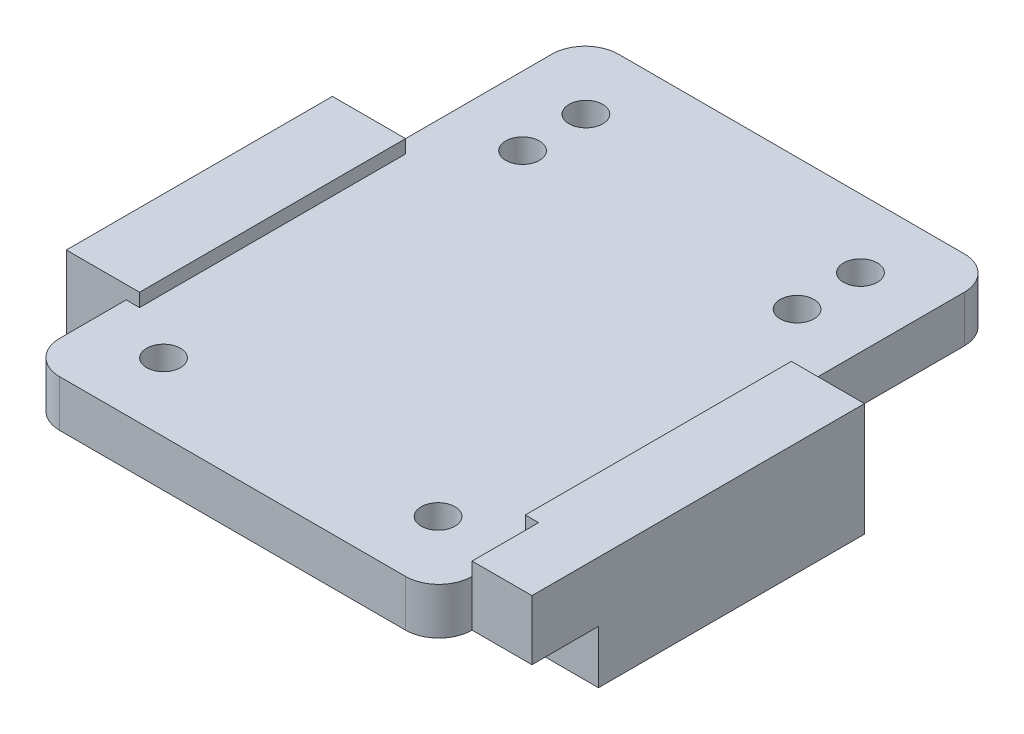
ISO-10303-21;
HEADER;
FILE_DESCRIPTION(('STEP AP214'),'2;1');
FILE_NAME('part.step','',(''),(''),'','','');
FILE_SCHEMA(('AUTOMOTIVE_DESIGN { 1 0 10303 214 1 1 1 1 }'));
ENDSEC;
DATA;
#1=APPLICATION_CONTEXT('core data for automotive mechanical design processes');
#2=APPLICATION_PROTOCOL_DEFINITION('international standard','automotive_design',2000,#1);
#3=PRODUCT_CONTEXT('',#1,'mechanical');
#4=PRODUCT('Part','Part','',(#3));
#5=PRODUCT_RELATED_PRODUCT_CATEGORY('part','',(#4));
#6=PRODUCT_DEFINITION_FORMATION('','',#4);
#7=PRODUCT_DEFINITION_CONTEXT('part definition',#1,'design');
#8=PRODUCT_DEFINITION('design','',#6,#7);
#9=PRODUCT_DEFINITION_SHAPE('','',#8);
#10=(LENGTH_UNIT() NAMED_UNIT(*) SI_UNIT(.MILLI.,.METRE.));
#11=(NAMED_UNIT(*) PLANE_ANGLE_UNIT() SI_UNIT($,.RADIAN.));
#12=(NAMED_UNIT(*) SI_UNIT($,.STERADIAN.) SOLID_ANGLE_UNIT());
#13=UNCERTAINTY_MEASURE_WITH_UNIT(LENGTH_MEASURE(1.E-05),#10,'distance_accuracy_value','');
#14=(GEOMETRIC_REPRESENTATION_CONTEXT(3) GLOBAL_UNCERTAINTY_ASSIGNED_CONTEXT((#13)) GLOBAL_UNIT_ASSIGNED_CONTEXT((#10,
#11,#12)) REPRESENTATION_CONTEXT('',''));
#15=CARTESIAN_POINT('',(0.,0.,0.));
#16=DIRECTION('',(0.,0.,1.));
#17=DIRECTION('',(1.,0.,0.));
#18=AXIS2_PLACEMENT_3D('',#15,#16,#17);
#19=CARTESIAN_POINT('',(29.,52.4849370253831,27.));
#20=DIRECTION('',(0.,0.,1.));
#21=DIRECTION('',(1.,0.,0.));
#22=AXIS2_PLACEMENT_3D('',#19,#20,#21);
#23=PLANE('',#22);
#24=DIRECTION('',(0.,-1.,0.));
#25=VECTOR('',#24,1.);
#26=CARTESIAN_POINT('',(40.,52.4849370253831,27.));
#27=LINE('',#26,#25);
#28=CARTESIAN_POINT('',(40.,0.,27.));
#29=VERTEX_POINT('',#28);
#30=CARTESIAN_POINT('',(40.,-8.,27.));
#31=VERTEX_POINT('',#30);
#32=EDGE_CURVE('E310',#29,#31,#27,.T.);
#33=ORIENTED_EDGE('',*,*,#32,.F.);
#34=DIRECTION('',(-1.,0.,0.));
#35=VECTOR('',#34,1.);
#36=CARTESIAN_POINT('',(0.,0.,27.));
#37=LINE('',#36,#35);
#38=CARTESIAN_POINT('',(29.,0.,27.));
#39=VERTEX_POINT('',#38);
#40=EDGE_CURVE('E223',#29,#39,#37,.T.);
#41=ORIENTED_EDGE('',*,*,#40,.T.);
#42=DIRECTION('',(0.,-1.,0.));
#43=VECTOR('',#42,1.);
#44=CARTESIAN_POINT('',(29.,52.4849370253831,27.));
#45=LINE('',#44,#43);
#46=CARTESIAN_POINT('',(29.,-8.,27.));
#47=VERTEX_POINT('',#46);
#48=EDGE_CURVE('E309',#39,#47,#45,.T.);
#49=ORIENTED_EDGE('',*,*,#48,.T.);
#50=DIRECTION('',(-1.,0.,0.));
#51=VECTOR('',#50,1.);
#52=CARTESIAN_POINT('',(29.,-8.,27.));
#53=LINE('',#52,#51);
#54=EDGE_CURVE('E295',#31,#47,#53,.T.);
#55=ORIENTED_EDGE('',*,*,#54,.F.);
#56=EDGE_LOOP('',(#33,#41,#49,#55));
#57=FACE_BOUND('',#56,.T.);
#58=ADVANCED_FACE('F46',(#57),#23,.T.);
#59=DIRECTION('',(-1.,0.,0.));
#60=VECTOR('',#59,1.);
#61=CARTESIAN_POINT('',(0.,7.,27.));
#62=LINE('',#61,#60);
#63=CARTESIAN_POINT('',(31.,7.00000000000001,27.));
#64=VERTEX_POINT('',#63);
#65=CARTESIAN_POINT('',(29.,7.,27.));
#66=VERTEX_POINT('',#65);
#67=EDGE_CURVE('E323',#64,#66,#62,.T.);
#68=ORIENTED_EDGE('',*,*,#67,.F.);
#69=DIRECTION('',(0.,1.,0.));
#70=VECTOR('',#69,1.);
#71=CARTESIAN_POINT('',(31.,0.,27.));
#72=LINE('',#71,#70);
#73=CARTESIAN_POINT('',(31.,9.,27.));
#74=VERTEX_POINT('',#73);
#75=EDGE_CURVE('E611',#64,#74,#72,.T.);
#76=ORIENTED_EDGE('',*,*,#75,.T.);
#77=DIRECTION('',(1.,0.,0.));
#78=VECTOR('',#77,1.);
#79=CARTESIAN_POINT('',(29.,9.,27.));
#80=LINE('',#79,#78);
#81=CARTESIAN_POINT('',(29.,9.,27.));
#82=VERTEX_POINT('',#81);
#83=EDGE_CURVE('E300',#82,#74,#80,.T.);
#84=ORIENTED_EDGE('',*,*,#83,.F.);
#85=EDGE_CURVE('E301',#82,#66,#45,.T.);
#86=ORIENTED_EDGE('',*,*,#85,.T.);
#87=EDGE_LOOP('',(#68,#76,#84,#86));
#88=FACE_BOUND('',#87,.T.);
#89=ADVANCED_FACE('F506',(#88),#23,.T.);
#90=CARTESIAN_POINT('',(-31.,7.,-42.));
#91=DIRECTION('',(1.,0.,0.));
#92=DIRECTION('',(0.,0.,-1.));
#93=AXIS2_PLACEMENT_3D('',#90,#91,#92);
#94=PLANE('',#93);
#95=DIRECTION('',(0.,0.,1.));
#96=VECTOR('',#95,1.);
#97=CARTESIAN_POINT('',(-31.,7.,-42.));
#98=LINE('',#97,#96);
#99=CARTESIAN_POINT('',(-31.,7.,27.));
#100=VERTEX_POINT('',#99);
#101=CARTESIAN_POINT('',(-31.,7.,37.));
#102=VERTEX_POINT('',#101);
#103=EDGE_CURVE('E351',#100,#102,#98,.T.);
#104=ORIENTED_EDGE('',*,*,#103,.F.);
#105=DIRECTION('',(0.,-1.,0.));
#106=VECTOR('',#105,1.);
#107=CARTESIAN_POINT('',(-31.,7.,27.));
#108=LINE('',#107,#106);
#109=CARTESIAN_POINT('',(-31.,0.,27.));
#110=VERTEX_POINT('',#109);
#111=EDGE_CURVE('E282',#100,#110,#108,.T.);
#112=ORIENTED_EDGE('',*,*,#111,.T.);
#113=DIRECTION('',(0.,0.,1.));
#114=VECTOR('',#113,1.);
#115=CARTESIAN_POINT('',(-31.,0.,-42.));
#116=LINE('',#115,#114);
#117=CARTESIAN_POINT('',(-31.,0.,37.));
#118=VERTEX_POINT('',#117);
#119=EDGE_CURVE('E366',#110,#118,#116,.T.);
#120=ORIENTED_EDGE('',*,*,#119,.T.);
#121=DIRECTION('',(0.,-1.,0.));
#122=VECTOR('',#121,1.);
#123=CARTESIAN_POINT('',(-31.,7.,37.));
#124=LINE('',#123,#122);
#125=EDGE_CURVE('E424',#118,#102,#124,.F.);
#126=ORIENTED_EDGE('',*,*,#125,.T.);
#127=EDGE_LOOP('',(#104,#112,#120,#126));
#128=FACE_BOUND('',#127,.T.);
#129=ADVANCED_FACE('F511',(#128),#94,.F.);
#130=CARTESIAN_POINT('',(-31.,0.,-37.));
#131=VERTEX_POINT('',#130);
#132=CARTESIAN_POINT('',(-31.,0.,-12.9999999999999));
#133=VERTEX_POINT('',#132);
#134=EDGE_CURVE('E362',#131,#133,#116,.T.);
#135=ORIENTED_EDGE('',*,*,#134,.T.);
#136=DIRECTION('',(0.,1.,0.));
#137=VECTOR('',#136,1.);
#138=CARTESIAN_POINT('',(-31.,7.,-12.9999999999999));
#139=LINE('',#138,#137);
#140=CARTESIAN_POINT('',(-31.,7.,-12.9999999999999));
#141=VERTEX_POINT('',#140);
#142=EDGE_CURVE('E278',#133,#141,#139,.T.);
#143=ORIENTED_EDGE('',*,*,#142,.T.);
#144=CARTESIAN_POINT('',(-31.,7.,-37.));
#145=VERTEX_POINT('',#144);
#146=EDGE_CURVE('E348',#145,#141,#98,.T.);
#147=ORIENTED_EDGE('',*,*,#146,.F.);
#148=DIRECTION('',(0.,-1.,0.));
#149=VECTOR('',#148,1.);
#150=CARTESIAN_POINT('',(-31.,7.,-37.));
#151=LINE('',#150,#149);
#152=EDGE_CURVE('E405',#145,#131,#151,.T.);
#153=ORIENTED_EDGE('',*,*,#152,.T.);
#154=EDGE_LOOP('',(#135,#143,#147,#153));
#155=FACE_BOUND('',#154,.T.);
#156=ADVANCED_FACE('F460',(#155),#94,.F.);
#157=CARTESIAN_POINT('',(31.,7.,42.));
#158=DIRECTION('',(0.,0.,-1.));
#159=DIRECTION('',(-1.,0.,0.));
#160=AXIS2_PLACEMENT_3D('',#157,#158,#159);
#161=PLANE('',#160);
#162=DIRECTION('',(1.,0.,0.));
#163=VECTOR('',#162,1.);
#164=CARTESIAN_POINT('',(31.,0.,42.));
#165=LINE('',#164,#163);
#166=CARTESIAN_POINT('',(-26.,0.,42.));
#167=VERTEX_POINT('',#166);
#168=CARTESIAN_POINT('',(26.,0.,42.));
#169=VERTEX_POINT('',#168);
#170=EDGE_CURVE('E365',#167,#169,#165,.T.);
#171=ORIENTED_EDGE('',*,*,#170,.T.);
#172=DIRECTION('',(0.,-1.,0.));
#173=VECTOR('',#172,1.);
#174=CARTESIAN_POINT('',(26.,7.,42.));
#175=LINE('',#174,#173);
#176=CARTESIAN_POINT('',(26.,7.,42.));
#177=VERTEX_POINT('',#176);
#178=EDGE_CURVE('E417',#169,#177,#175,.F.);
#179=ORIENTED_EDGE('',*,*,#178,.T.);
#180=DIRECTION('',(1.,0.,0.));
#181=VECTOR('',#180,1.);
#182=CARTESIAN_POINT('',(31.,7.,42.));
#183=LINE('',#182,#181);
#184=CARTESIAN_POINT('',(-26.,7.,42.));
#185=VERTEX_POINT('',#184);
#186=EDGE_CURVE('E350',#185,#177,#183,.T.);
#187=ORIENTED_EDGE('',*,*,#186,.F.);
#188=DIRECTION('',(0.,-1.,0.));
#189=VECTOR('',#188,1.);
#190=CARTESIAN_POINT('',(-26.,7.,42.));
#191=LINE('',#190,#189);
#192=EDGE_CURVE('E414',#185,#167,#191,.T.);
#193=ORIENTED_EDGE('',*,*,#192,.T.);
#194=EDGE_LOOP('',(#171,#179,#187,#193));
#195=FACE_BOUND('',#194,.T.);
#196=ADVANCED_FACE('F555',(#195),#161,.F.);
#197=CARTESIAN_POINT('',(31.,7.,-42.));
#198=DIRECTION('',(-1.,0.,0.));
#199=DIRECTION('',(0.,0.,1.));
#200=AXIS2_PLACEMENT_3D('',#197,#198,#199);
#201=PLANE('',#200);
#202=DIRECTION('',(0.,0.,-1.));
#203=VECTOR('',#202,1.);
#204=CARTESIAN_POINT('',(31.,7.,-42.));
#205=LINE('',#204,#203);
#206=CARTESIAN_POINT('',(31.,7.,-13.));
#207=VERTEX_POINT('',#206);
#208=CARTESIAN_POINT('',(31.,7.,-37.));
#209=VERTEX_POINT('',#208);
#210=EDGE_CURVE('E354',#207,#209,#205,.T.);
#211=ORIENTED_EDGE('',*,*,#210,.F.);
#212=DIRECTION('',(0.,-1.,0.));
#213=VECTOR('',#212,1.);
#214=CARTESIAN_POINT('',(31.,7.,-13.));
#215=LINE('',#214,#213);
#216=CARTESIAN_POINT('',(31.,0.,-13.));
#217=VERTEX_POINT('',#216);
#218=EDGE_CURVE('E318',#207,#217,#215,.T.);
#219=ORIENTED_EDGE('',*,*,#218,.T.);
#220=DIRECTION('',(0.,0.,-1.));
#221=VECTOR('',#220,1.);
#222=CARTESIAN_POINT('',(31.,0.,-42.));
#223=LINE('',#222,#221);
#224=CARTESIAN_POINT('',(31.,0.,-37.));
#225=VERTEX_POINT('',#224);
#226=EDGE_CURVE('E369',#217,#225,#223,.T.);
#227=ORIENTED_EDGE('',*,*,#226,.T.);
#228=DIRECTION('',(0.,-1.,0.));
#229=VECTOR('',#228,1.);
#230=CARTESIAN_POINT('',(31.,7.,-37.));
#231=LINE('',#230,#229);
#232=EDGE_CURVE('E398',#225,#209,#231,.F.);
#233=ORIENTED_EDGE('',*,*,#232,.T.);
#234=EDGE_LOOP('',(#211,#219,#227,#233));
#235=FACE_BOUND('',#234,.T.);
#236=ADVANCED_FACE('F479',(#235),#201,.F.);
#237=CARTESIAN_POINT('',(31.,7.,-42.));
#238=DIRECTION('',(0.,0.,1.));
#239=DIRECTION('',(1.,0.,0.));
#240=AXIS2_PLACEMENT_3D('',#237,#238,#239);
#241=PLANE('',#240);
#242=DIRECTION('',(-1.,0.,0.));
#243=VECTOR('',#242,1.);
#244=CARTESIAN_POINT('',(31.,7.,-42.));
#245=LINE('',#244,#243);
#246=CARTESIAN_POINT('',(26.,7.,-42.));
#247=VERTEX_POINT('',#246);
#248=CARTESIAN_POINT('',(-26.,7.,-42.));
#249=VERTEX_POINT('',#248);
#250=EDGE_CURVE('E358',#247,#249,#245,.T.);
#251=ORIENTED_EDGE('',*,*,#250,.F.);
#252=DIRECTION('',(0.,-1.,0.));
#253=VECTOR('',#252,1.);
#254=CARTESIAN_POINT('',(26.,7.,-42.));
#255=LINE('',#254,#253);
#256=CARTESIAN_POINT('',(26.,0.,-42.));
#257=VERTEX_POINT('',#256);
#258=EDGE_CURVE('E390',#247,#257,#255,.T.);
#259=ORIENTED_EDGE('',*,*,#258,.T.);
#260=DIRECTION('',(-1.,0.,0.));
#261=VECTOR('',#260,1.);
#262=CARTESIAN_POINT('',(31.,0.,-42.));
#263=LINE('',#262,#261);
#264=CARTESIAN_POINT('',(-26.,0.,-42.));
#265=VERTEX_POINT('',#264);
#266=EDGE_CURVE('E371',#257,#265,#263,.T.);
#267=ORIENTED_EDGE('',*,*,#266,.T.);
#268=DIRECTION('',(0.,-1.,0.));
#269=VECTOR('',#268,1.);
#270=CARTESIAN_POINT('',(-26.,7.,-42.));
#271=LINE('',#270,#269);
#272=EDGE_CURVE('E361',#265,#249,#271,.F.);
#273=ORIENTED_EDGE('',*,*,#272,.T.);
#274=EDGE_LOOP('',(#251,#259,#267,#273));
#275=FACE_BOUND('',#274,.T.);
#276=ADVANCED_FACE('F470',(#275),#241,.F.);
#277=CARTESIAN_POINT('',(0.,7.,0.));
#278=DIRECTION('',(0.,-1.,0.));
#279=DIRECTION('',(0.,0.,-1.));
#280=AXIS2_PLACEMENT_3D('',#277,#278,#279);
#281=PLANE('',#280);
#282=CARTESIAN_POINT('',(20.6375,7.,-22.225));
#283=DIRECTION('',(0.,-1.,0.));
#284=DIRECTION('',(0.,0.,-1.));
#285=AXIS2_PLACEMENT_3D('',#282,#283,#284);
#286=CIRCLE('',#285,2.54);
#287=CARTESIAN_POINT('',(20.6375,7.,-24.765));
#288=VERTEX_POINT('',#287);
#289=EDGE_CURVE('E328',#288,#288,#286,.T.);
#290=ORIENTED_EDGE('',*,*,#289,.T.);
#291=EDGE_LOOP('',(#290));
#292=FACE_BOUND('',#291,.T.);
#293=CARTESIAN_POINT('',(20.6375,7.,-31.75));
#294=DIRECTION('',(0.,-1.,0.));
#295=DIRECTION('',(0.,0.,-1.));
#296=AXIS2_PLACEMENT_3D('',#293,#294,#295);
#297=CIRCLE('',#296,2.54);
#298=CARTESIAN_POINT('',(20.6375,7.,-34.29));
#299=VERTEX_POINT('',#298);
#300=EDGE_CURVE('E332',#299,#299,#297,.T.);
#301=ORIENTED_EDGE('',*,*,#300,.T.);
#302=EDGE_LOOP('',(#301));
#303=FACE_BOUND('',#302,.T.);
#304=CARTESIAN_POINT('',(-20.6375,7.,-31.75));
#305=DIRECTION('',(0.,-1.,0.));
#306=DIRECTION('',(0.,0.,-1.));
#307=AXIS2_PLACEMENT_3D('',#304,#305,#306);
#308=CIRCLE('',#307,2.54);
#309=CARTESIAN_POINT('',(-20.6375,7.,-34.29));
#310=VERTEX_POINT('',#309);
#311=EDGE_CURVE('E335',#310,#310,#308,.T.);
#312=ORIENTED_EDGE('',*,*,#311,.T.);
#313=EDGE_LOOP('',(#312));
#314=FACE_BOUND('',#313,.T.);
#315=CARTESIAN_POINT('',(-20.6375,7.,-22.225));
#316=DIRECTION('',(0.,-1.,0.));
#317=DIRECTION('',(0.,0.,-1.));
#318=AXIS2_PLACEMENT_3D('',#315,#316,#317);
#319=CIRCLE('',#318,2.54);
#320=CARTESIAN_POINT('',(-20.6375,7.,-24.765));
#321=VERTEX_POINT('',#320);
#322=EDGE_CURVE('E338',#321,#321,#319,.T.);
#323=ORIENTED_EDGE('',*,*,#322,.T.);
#324=EDGE_LOOP('',(#323));
#325=FACE_BOUND('',#324,.T.);
#326=CARTESIAN_POINT('',(-20.6375,7.,31.75));
#327=DIRECTION('',(0.,-1.,0.));
#328=DIRECTION('',(0.,0.,-1.));
#329=AXIS2_PLACEMENT_3D('',#326,#327,#328);
#330=CIRCLE('',#329,2.54);
#331=CARTESIAN_POINT('',(-20.6375,7.,29.21));
#332=VERTEX_POINT('',#331);
#333=EDGE_CURVE('E327',#332,#332,#330,.T.);
#334=ORIENTED_EDGE('',*,*,#333,.T.);
#335=EDGE_LOOP('',(#334));
#336=FACE_BOUND('',#335,.T.);
#337=CARTESIAN_POINT('',(20.6375,7.,31.75));
#338=DIRECTION('',(0.,-1.,0.));
#339=DIRECTION('',(0.,0.,-1.));
#340=AXIS2_PLACEMENT_3D('',#337,#338,#339);
#341=CIRCLE('',#340,2.54);
#342=CARTESIAN_POINT('',(20.6375,7.,29.21));
#343=VERTEX_POINT('',#342);
#344=EDGE_CURVE('E343',#343,#343,#341,.T.);
#345=ORIENTED_EDGE('',*,*,#344,.T.);
#346=EDGE_LOOP('',(#345));
#347=FACE_BOUND('',#346,.T.);
#348=DIRECTION('',(0.,0.,1.));
#349=VECTOR('',#348,1.);
#350=CARTESIAN_POINT('',(-29.,7.,0.));
#351=LINE('',#350,#349);
#352=CARTESIAN_POINT('',(-29.,7.,-12.9999999999999));
#353=VERTEX_POINT('',#352);
#354=CARTESIAN_POINT('',(-29.,7.,27.));
#355=VERTEX_POINT('',#354);
#356=EDGE_CURVE('E61',#353,#355,#351,.T.);
#357=ORIENTED_EDGE('',*,*,#356,.T.);
#358=DIRECTION('',(-1.,0.,0.));
#359=VECTOR('',#358,1.);
#360=CARTESIAN_POINT('',(0.,7.,27.));
#361=LINE('',#360,#359);
#362=EDGE_CURVE('E284',#355,#100,#361,.T.);
#363=ORIENTED_EDGE('',*,*,#362,.T.);
#364=ORIENTED_EDGE('',*,*,#103,.T.);
#365=CARTESIAN_POINT('',(-26.,7.,37.));
#366=DIRECTION('',(0.,-1.,0.));
#367=DIRECTION('',(0.,0.,-1.));
#368=AXIS2_PLACEMENT_3D('',#365,#366,#367);
#369=CIRCLE('',#368,5.);
#370=EDGE_CURVE('E419',#102,#185,#369,.F.);
#371=ORIENTED_EDGE('',*,*,#370,.T.);
#372=ORIENTED_EDGE('',*,*,#186,.T.);
#373=CARTESIAN_POINT('',(26.,7.,37.));
#374=DIRECTION('',(0.,-1.,0.));
#375=DIRECTION('',(0.,0.,-1.));
#376=AXIS2_PLACEMENT_3D('',#373,#374,#375);
#377=CIRCLE('',#376,5.);
#378=CARTESIAN_POINT('',(31.,7.,37.));
#379=VERTEX_POINT('',#378);
#380=EDGE_CURVE('E421',#177,#379,#377,.F.);
#381=ORIENTED_EDGE('',*,*,#380,.T.);
#382=EDGE_CURVE('E355',#379,#64,#205,.T.);
#383=ORIENTED_EDGE('',*,*,#382,.T.);
#384=ORIENTED_EDGE('',*,*,#67,.T.);
#385=DIRECTION('',(0.,0.,-1.));
#386=VECTOR('',#385,1.);
#387=CARTESIAN_POINT('',(29.,7.,0.));
#388=LINE('',#387,#386);
#389=CARTESIAN_POINT('',(29.,7.,-13.));
#390=VERTEX_POINT('',#389);
#391=EDGE_CURVE('E325',#66,#390,#388,.T.);
#392=ORIENTED_EDGE('',*,*,#391,.T.);
#393=DIRECTION('',(1.,0.,0.));
#394=VECTOR('',#393,1.);
#395=CARTESIAN_POINT('',(0.,7.,-13.));
#396=LINE('',#395,#394);
#397=EDGE_CURVE('E321',#390,#207,#396,.T.);
#398=ORIENTED_EDGE('',*,*,#397,.T.);
#399=ORIENTED_EDGE('',*,*,#210,.T.);
#400=CARTESIAN_POINT('',(26.,7.,-37.));
#401=DIRECTION('',(0.,-1.,0.));
#402=DIRECTION('',(0.,0.,-1.));
#403=AXIS2_PLACEMENT_3D('',#400,#401,#402);
#404=CIRCLE('',#403,5.);
#405=EDGE_CURVE('E403',#209,#247,#404,.F.);
#406=ORIENTED_EDGE('',*,*,#405,.T.);
#407=ORIENTED_EDGE('',*,*,#250,.T.);
#408=CARTESIAN_POINT('',(-26.,7.,-37.));
#409=DIRECTION('',(0.,-1.,0.));
#410=DIRECTION('',(0.,0.,-1.));
#411=AXIS2_PLACEMENT_3D('',#408,#409,#410);
#412=CIRCLE('',#411,5.);
#413=EDGE_CURVE('E401',#249,#145,#412,.F.);
#414=ORIENTED_EDGE('',*,*,#413,.T.);
#415=ORIENTED_EDGE('',*,*,#146,.T.);
#416=DIRECTION('',(1.,0.,0.));
#417=VECTOR('',#416,1.);
#418=CARTESIAN_POINT('',(0.,7.,-12.9999999999999));
#419=LINE('',#418,#417);
#420=EDGE_CURVE('E66',#141,#353,#419,.T.);
#421=ORIENTED_EDGE('',*,*,#420,.T.);
#422=EDGE_LOOP('',(#357,#363,#364,#371,#372,#381,#383,#384,#392,#398,#399,#406,#407,#414,#415,#421));
#423=FACE_BOUND('',#422,.T.);
#424=ADVANCED_FACE('F545',(#292,#303,#314,#325,#336,#347,#423),#281,.F.);
#425=CARTESIAN_POINT('',(0.,0.,0.));
#426=DIRECTION('',(0.,-1.,0.));
#427=DIRECTION('',(0.,0.,-1.));
#428=AXIS2_PLACEMENT_3D('',#425,#426,#427);
#429=PLANE('',#428);
#430=DIRECTION('',(-1.,0.,0.));
#431=VECTOR('',#430,1.);
#432=CARTESIAN_POINT('',(0.,0.,27.));
#433=LINE('',#432,#431);
#434=CARTESIAN_POINT('',(-29.,0.,27.));
#435=VERTEX_POINT('',#434);
#436=EDGE_CURVE('E12',#435,#110,#433,.T.);
#437=ORIENTED_EDGE('',*,*,#436,.F.);
#438=DIRECTION('',(0.,0.,1.));
#439=VECTOR('',#438,1.);
#440=CARTESIAN_POINT('',(-29.,0.,0.));
#441=LINE('',#440,#439);
#442=CARTESIAN_POINT('',(-29.,0.,-12.9999999999999));
#443=VERTEX_POINT('',#442);
#444=EDGE_CURVE('E54',#443,#435,#441,.T.);
#445=ORIENTED_EDGE('',*,*,#444,.F.);
#446=DIRECTION('',(1.,0.,0.));
#447=VECTOR('',#446,1.);
#448=CARTESIAN_POINT('',(0.,0.,-12.9999999999999));
#449=LINE('',#448,#447);
#450=EDGE_CURVE('E434',#133,#443,#449,.T.);
#451=ORIENTED_EDGE('',*,*,#450,.F.);
#452=ORIENTED_EDGE('',*,*,#134,.F.);
#453=CARTESIAN_POINT('',(-26.,0.,-37.));
#454=DIRECTION('',(0.,-1.,0.));
#455=DIRECTION('',(0.,0.,-1.));
#456=AXIS2_PLACEMENT_3D('',#453,#454,#455);
#457=CIRCLE('',#456,5.);
#458=EDGE_CURVE('E393',#131,#265,#457,.T.);
#459=ORIENTED_EDGE('',*,*,#458,.T.);
#460=ORIENTED_EDGE('',*,*,#266,.F.);
#461=CARTESIAN_POINT('',(26.,0.,-37.));
#462=DIRECTION('',(0.,-1.,0.));
#463=DIRECTION('',(0.,0.,-1.));
#464=AXIS2_PLACEMENT_3D('',#461,#462,#463);
#465=CIRCLE('',#464,5.);
#466=EDGE_CURVE('E395',#257,#225,#465,.T.);
#467=ORIENTED_EDGE('',*,*,#466,.T.);
#468=ORIENTED_EDGE('',*,*,#226,.F.);
#469=DIRECTION('',(1.,0.,0.));
#470=VECTOR('',#469,1.);
#471=CARTESIAN_POINT('',(0.,0.,-13.));
#472=LINE('',#471,#470);
#473=CARTESIAN_POINT('',(29.,0.,-13.));
#474=VERTEX_POINT('',#473);
#475=EDGE_CURVE('E427',#474,#217,#472,.T.);
#476=ORIENTED_EDGE('',*,*,#475,.F.);
#477=DIRECTION('',(0.,0.,-1.));
#478=VECTOR('',#477,1.);
#479=CARTESIAN_POINT('',(29.,0.,0.));
#480=LINE('',#479,#478);
#481=EDGE_CURVE('E430',#39,#474,#480,.T.);
#482=ORIENTED_EDGE('',*,*,#481,.F.);
#483=ORIENTED_EDGE('',*,*,#40,.F.);
#484=DIRECTION('',(0.,0.,-1.));
#485=VECTOR('',#484,1.);
#486=CARTESIAN_POINT('',(40.,0.,37.));
#487=LINE('',#486,#485);
#488=CARTESIAN_POINT('',(40.,0.,37.));
#489=VERTEX_POINT('',#488);
#490=EDGE_CURVE('E215',#489,#29,#487,.T.);
#491=ORIENTED_EDGE('',*,*,#490,.F.);
#492=DIRECTION('',(-1.,0.,0.));
#493=VECTOR('',#492,1.);
#494=CARTESIAN_POINT('',(40.,0.,37.));
#495=LINE('',#494,#493);
#496=CARTESIAN_POINT('',(31.,0.,37.));
#497=VERTEX_POINT('',#496);
#498=EDGE_CURVE('E220',#489,#497,#495,.T.);
#499=ORIENTED_EDGE('',*,*,#498,.T.);
#500=CARTESIAN_POINT('',(26.,0.,37.));
#501=DIRECTION('',(0.,-1.,0.));
#502=DIRECTION('',(0.,0.,-1.));
#503=AXIS2_PLACEMENT_3D('',#500,#501,#502);
#504=CIRCLE('',#503,5.);
#505=EDGE_CURVE('E412',#497,#169,#504,.T.);
#506=ORIENTED_EDGE('',*,*,#505,.T.);
#507=ORIENTED_EDGE('',*,*,#170,.F.);
#508=CARTESIAN_POINT('',(-26.,0.,37.));
#509=DIRECTION('',(0.,-1.,0.));
#510=DIRECTION('',(0.,0.,-1.));
#511=AXIS2_PLACEMENT_3D('',#508,#509,#510);
#512=CIRCLE('',#511,5.);
#513=EDGE_CURVE('E409',#167,#118,#512,.T.);
#514=ORIENTED_EDGE('',*,*,#513,.T.);
#515=ORIENTED_EDGE('',*,*,#119,.F.);
#516=EDGE_LOOP('',(#437,#445,#451,#452,#459,#460,#467,#468,#476,#482,#483,#491,#499,#506,#507,
#514,#515));
#517=FACE_BOUND('',#516,.T.);
#518=CARTESIAN_POINT('',(20.6375,0.,-22.225));
#519=DIRECTION('',(0.,-1.,0.));
#520=DIRECTION('',(0.,0.,-1.));
#521=AXIS2_PLACEMENT_3D('',#518,#519,#520);
#522=CIRCLE('',#521,2.54);
#523=CARTESIAN_POINT('',(20.6375,0.,-24.765));
#524=VERTEX_POINT('',#523);
#525=EDGE_CURVE('E347',#524,#524,#522,.T.);
#526=ORIENTED_EDGE('',*,*,#525,.F.);
#527=EDGE_LOOP('',(#526));
#528=FACE_BOUND('',#527,.T.);
#529=CARTESIAN_POINT('',(20.6375,0.,-31.75));
#530=DIRECTION('',(0.,-1.,0.));
#531=DIRECTION('',(0.,0.,-1.));
#532=AXIS2_PLACEMENT_3D('',#529,#530,#531);
#533=CIRCLE('',#532,2.54);
#534=CARTESIAN_POINT('',(20.6375,0.,-34.29));
#535=VERTEX_POINT('',#534);
#536=EDGE_CURVE('E384',#535,#535,#533,.T.);
#537=ORIENTED_EDGE('',*,*,#536,.F.);
#538=EDGE_LOOP('',(#537));
#539=FACE_BOUND('',#538,.T.);
#540=CARTESIAN_POINT('',(-20.6375,0.,-31.75));
#541=DIRECTION('',(0.,-1.,0.));
#542=DIRECTION('',(0.,0.,-1.));
#543=AXIS2_PLACEMENT_3D('',#540,#541,#542);
#544=CIRCLE('',#543,2.54);
#545=CARTESIAN_POINT('',(-20.6375,0.,-34.29));
#546=VERTEX_POINT('',#545);
#547=EDGE_CURVE('E381',#546,#546,#544,.T.);
#548=ORIENTED_EDGE('',*,*,#547,.F.);
#549=EDGE_LOOP('',(#548));
#550=FACE_BOUND('',#549,.T.);
#551=CARTESIAN_POINT('',(-20.6375,0.,-22.225));
#552=DIRECTION('',(0.,-1.,0.));
#553=DIRECTION('',(0.,0.,-1.));
#554=AXIS2_PLACEMENT_3D('',#551,#552,#553);
#555=CIRCLE('',#554,2.54);
#556=CARTESIAN_POINT('',(-20.6375,0.,-24.765));
#557=VERTEX_POINT('',#556);
#558=EDGE_CURVE('E378',#557,#557,#555,.T.);
#559=ORIENTED_EDGE('',*,*,#558,.F.);
#560=EDGE_LOOP('',(#559));
#561=FACE_BOUND('',#560,.T.);
#562=CARTESIAN_POINT('',(-20.6375,0.,31.75));
#563=DIRECTION('',(0.,-1.,0.));
#564=DIRECTION('',(0.,0.,-1.));
#565=AXIS2_PLACEMENT_3D('',#562,#563,#564);
#566=CIRCLE('',#565,2.54);
#567=CARTESIAN_POINT('',(-20.6375,0.,29.21));
#568=VERTEX_POINT('',#567);
#569=EDGE_CURVE('E331',#568,#568,#566,.T.);
#570=ORIENTED_EDGE('',*,*,#569,.F.);
#571=EDGE_LOOP('',(#570));
#572=FACE_BOUND('',#571,.T.);
#573=CARTESIAN_POINT('',(20.6375,0.,31.75));
#574=DIRECTION('',(0.,-1.,0.));
#575=DIRECTION('',(0.,0.,-1.));
#576=AXIS2_PLACEMENT_3D('',#573,#574,#575);
#577=CIRCLE('',#576,2.54);
#578=CARTESIAN_POINT('',(20.6375,0.,29.21));
#579=VERTEX_POINT('',#578);
#580=EDGE_CURVE('E346',#579,#579,#577,.T.);
#581=ORIENTED_EDGE('',*,*,#580,.F.);
#582=EDGE_LOOP('',(#581));
#583=FACE_BOUND('',#582,.T.);
#584=ADVANCED_FACE('F217',(#517,#528,#539,#550,#561,#572,#583),#429,.T.);
#585=CARTESIAN_POINT('',(20.6375,7.,31.75));
#586=DIRECTION('',(0.,-1.,0.));
#587=DIRECTION('',(0.,0.,-1.));
#588=AXIS2_PLACEMENT_3D('',#585,#586,#587);
#589=CYLINDRICAL_SURFACE('',#588,2.54);
#590=ORIENTED_EDGE('',*,*,#580,.T.);
#591=EDGE_LOOP('',(#590));
#592=FACE_BOUND('',#591,.T.);
#593=ORIENTED_EDGE('',*,*,#344,.F.);
#594=EDGE_LOOP('',(#593));
#595=FACE_BOUND('',#594,.T.);
#596=ADVANCED_FACE('F540',(#592,#595),#589,.F.);
#597=CARTESIAN_POINT('',(-20.6375,7.,31.75));
#598=DIRECTION('',(0.,-1.,0.));
#599=DIRECTION('',(0.,0.,-1.));
#600=AXIS2_PLACEMENT_3D('',#597,#598,#599);
#601=CYLINDRICAL_SURFACE('',#600,2.54);
#602=ORIENTED_EDGE('',*,*,#569,.T.);
#603=EDGE_LOOP('',(#602));
#604=FACE_BOUND('',#603,.T.);
#605=ORIENTED_EDGE('',*,*,#333,.F.);
#606=EDGE_LOOP('',(#605));
#607=FACE_BOUND('',#606,.T.);
#608=ADVANCED_FACE('F536',(#604,#607),#601,.F.);
#609=CARTESIAN_POINT('',(-20.6375,7.,-22.225));
#610=DIRECTION('',(0.,-1.,0.));
#611=DIRECTION('',(0.,0.,-1.));
#612=AXIS2_PLACEMENT_3D('',#609,#610,#611);
#613=CYLINDRICAL_SURFACE('',#612,2.54);
#614=ORIENTED_EDGE('',*,*,#558,.T.);
#615=EDGE_LOOP('',(#614));
#616=FACE_BOUND('',#615,.T.);
#617=ORIENTED_EDGE('',*,*,#322,.F.);
#618=EDGE_LOOP('',(#617));
#619=FACE_BOUND('',#618,.T.);
#620=ADVANCED_FACE('F532',(#616,#619),#613,.F.);
#621=CARTESIAN_POINT('',(-20.6375,7.,-31.75));
#622=DIRECTION('',(0.,-1.,0.));
#623=DIRECTION('',(0.,0.,-1.));
#624=AXIS2_PLACEMENT_3D('',#621,#622,#623);
#625=CYLINDRICAL_SURFACE('',#624,2.54);
#626=ORIENTED_EDGE('',*,*,#547,.T.);
#627=EDGE_LOOP('',(#626));
#628=FACE_BOUND('',#627,.T.);
#629=ORIENTED_EDGE('',*,*,#311,.F.);
#630=EDGE_LOOP('',(#629));
#631=FACE_BOUND('',#630,.T.);
#632=ADVANCED_FACE('F528',(#628,#631),#625,.F.);
#633=CARTESIAN_POINT('',(20.6375,7.,-31.75));
#634=DIRECTION('',(0.,-1.,0.));
#635=DIRECTION('',(0.,0.,-1.));
#636=AXIS2_PLACEMENT_3D('',#633,#634,#635);
#637=CYLINDRICAL_SURFACE('',#636,2.54);
#638=ORIENTED_EDGE('',*,*,#536,.T.);
#639=EDGE_LOOP('',(#638));
#640=FACE_BOUND('',#639,.T.);
#641=ORIENTED_EDGE('',*,*,#300,.F.);
#642=EDGE_LOOP('',(#641));
#643=FACE_BOUND('',#642,.T.);
#644=ADVANCED_FACE('F524',(#640,#643),#637,.F.);
#645=CARTESIAN_POINT('',(20.6375,7.,-22.225));
#646=DIRECTION('',(0.,-1.,0.));
#647=DIRECTION('',(0.,0.,-1.));
#648=AXIS2_PLACEMENT_3D('',#645,#646,#647);
#649=CYLINDRICAL_SURFACE('',#648,2.54);
#650=ORIENTED_EDGE('',*,*,#525,.T.);
#651=EDGE_LOOP('',(#650));
#652=FACE_BOUND('',#651,.T.);
#653=ORIENTED_EDGE('',*,*,#289,.F.);
#654=EDGE_LOOP('',(#653));
#655=FACE_BOUND('',#654,.T.);
#656=ADVANCED_FACE('F521',(#652,#655),#649,.F.);
#657=CARTESIAN_POINT('',(26.,7.,-37.));
#658=DIRECTION('',(0.,-1.,0.));
#659=DIRECTION('',(0.,0.,-1.));
#660=AXIS2_PLACEMENT_3D('',#657,#658,#659);
#661=CYLINDRICAL_SURFACE('',#660,5.);
#662=ORIENTED_EDGE('',*,*,#405,.F.);
#663=ORIENTED_EDGE('',*,*,#232,.F.);
#664=ORIENTED_EDGE('',*,*,#466,.F.);
#665=ORIENTED_EDGE('',*,*,#258,.F.);
#666=EDGE_LOOP('',(#662,#663,#664,#665));
#667=FACE_BOUND('',#666,.T.);
#668=ADVANCED_FACE('F474',(#667),#661,.T.);
#669=CARTESIAN_POINT('',(-26.,7.,-37.));
#670=DIRECTION('',(0.,-1.,0.));
#671=DIRECTION('',(0.,0.,-1.));
#672=AXIS2_PLACEMENT_3D('',#669,#670,#671);
#673=CYLINDRICAL_SURFACE('',#672,5.);
#674=ORIENTED_EDGE('',*,*,#413,.F.);
#675=ORIENTED_EDGE('',*,*,#272,.F.);
#676=ORIENTED_EDGE('',*,*,#458,.F.);
#677=ORIENTED_EDGE('',*,*,#152,.F.);
#678=EDGE_LOOP('',(#674,#675,#676,#677));
#679=FACE_BOUND('',#678,.T.);
#680=ADVANCED_FACE('F465',(#679),#673,.T.);
#681=CARTESIAN_POINT('',(26.,7.,37.));
#682=DIRECTION('',(0.,-1.,0.));
#683=DIRECTION('',(0.,0.,-1.));
#684=AXIS2_PLACEMENT_3D('',#681,#682,#683);
#685=CYLINDRICAL_SURFACE('',#684,5.);
#686=ORIENTED_EDGE('',*,*,#380,.F.);
#687=ORIENTED_EDGE('',*,*,#178,.F.);
#688=ORIENTED_EDGE('',*,*,#505,.F.);
#689=DIRECTION('',(0.,-1.,0.));
#690=VECTOR('',#689,1.);
#691=CARTESIAN_POINT('',(31.,7.,37.));
#692=LINE('',#691,#690);
#693=EDGE_CURVE('E241',#379,#497,#692,.T.);
#694=ORIENTED_EDGE('',*,*,#693,.F.);
#695=EDGE_LOOP('',(#686,#687,#688,#694));
#696=FACE_BOUND('',#695,.T.);
#697=ADVANCED_FACE('F564',(#696),#685,.T.);
#698=CARTESIAN_POINT('',(-26.,7.,37.));
#699=DIRECTION('',(0.,-1.,0.));
#700=DIRECTION('',(0.,0.,-1.));
#701=AXIS2_PLACEMENT_3D('',#698,#699,#700);
#702=CYLINDRICAL_SURFACE('',#701,5.);
#703=ORIENTED_EDGE('',*,*,#370,.F.);
#704=ORIENTED_EDGE('',*,*,#125,.F.);
#705=ORIENTED_EDGE('',*,*,#513,.F.);
#706=ORIENTED_EDGE('',*,*,#192,.F.);
#707=EDGE_LOOP('',(#703,#704,#705,#706));
#708=FACE_BOUND('',#707,.T.);
#709=ADVANCED_FACE('F48',(#708),#702,.T.);
#710=CARTESIAN_POINT('',(29.,52.4849370253831,27.));
#711=DIRECTION('',(-1.,0.,0.));
#712=DIRECTION('',(0.,0.,1.));
#713=AXIS2_PLACEMENT_3D('',#710,#711,#712);
#714=PLANE('',#713);
#715=ORIENTED_EDGE('',*,*,#391,.F.);
#716=ORIENTED_EDGE('',*,*,#85,.F.);
#717=DIRECTION('',(0.,0.,1.));
#718=VECTOR('',#717,1.);
#719=CARTESIAN_POINT('',(29.,9.,27.));
#720=LINE('',#719,#718);
#721=CARTESIAN_POINT('',(29.,9.,-13.));
#722=VERTEX_POINT('',#721);
#723=EDGE_CURVE('E304',#722,#82,#720,.T.);
#724=ORIENTED_EDGE('',*,*,#723,.F.);
#725=DIRECTION('',(0.,-1.,0.));
#726=VECTOR('',#725,1.);
#727=CARTESIAN_POINT('',(29.,52.4849370253831,-13.));
#728=LINE('',#727,#726);
#729=EDGE_CURVE('E314',#722,#390,#728,.T.);
#730=ORIENTED_EDGE('',*,*,#729,.T.);
#731=EDGE_LOOP('',(#715,#716,#724,#730));
#732=FACE_BOUND('',#731,.T.);
#733=ADVANCED_FACE('F518',(#732),#714,.T.);
#734=CARTESIAN_POINT('',(29.,52.4849370253831,-13.));
#735=DIRECTION('',(0.,0.,-1.));
#736=DIRECTION('',(-1.,0.,0.));
#737=AXIS2_PLACEMENT_3D('',#734,#735,#736);
#738=PLANE('',#737);
#739=ORIENTED_EDGE('',*,*,#397,.F.);
#740=ORIENTED_EDGE('',*,*,#729,.F.);
#741=DIRECTION('',(-1.,0.,0.));
#742=VECTOR('',#741,1.);
#743=CARTESIAN_POINT('',(29.,9.,-13.));
#744=LINE('',#743,#742);
#745=CARTESIAN_POINT('',(40.,9.00000000000001,-13.));
#746=VERTEX_POINT('',#745);
#747=EDGE_CURVE('E306',#746,#722,#744,.T.);
#748=ORIENTED_EDGE('',*,*,#747,.F.);
#749=DIRECTION('',(0.,-1.,0.));
#750=VECTOR('',#749,1.);
#751=CARTESIAN_POINT('',(40.,52.4849370253831,-13.));
#752=LINE('',#751,#750);
#753=CARTESIAN_POINT('',(40.,-8.,-13.));
#754=VERTEX_POINT('',#753);
#755=EDGE_CURVE('E312',#746,#754,#752,.T.);
#756=ORIENTED_EDGE('',*,*,#755,.T.);
#757=DIRECTION('',(1.,0.,0.));
#758=VECTOR('',#757,1.);
#759=CARTESIAN_POINT('',(29.,-8.,-13.));
#760=LINE('',#759,#758);
#761=CARTESIAN_POINT('',(29.,-8.,-13.));
#762=VERTEX_POINT('',#761);
#763=EDGE_CURVE('E289',#762,#754,#760,.T.);
#764=ORIENTED_EDGE('',*,*,#763,.F.);
#765=EDGE_CURVE('E298',#474,#762,#728,.T.);
#766=ORIENTED_EDGE('',*,*,#765,.F.);
#767=ORIENTED_EDGE('',*,*,#475,.T.);
#768=ORIENTED_EDGE('',*,*,#218,.F.);
#769=EDGE_LOOP('',(#739,#740,#748,#756,#764,#766,#767,#768));
#770=FACE_BOUND('',#769,.T.);
#771=ADVANCED_FACE('F483',(#770),#738,.T.);
#772=ORIENTED_EDGE('',*,*,#48,.F.);
#773=ORIENTED_EDGE('',*,*,#481,.T.);
#774=ORIENTED_EDGE('',*,*,#765,.T.);
#775=DIRECTION('',(0.,0.,-1.));
#776=VECTOR('',#775,1.);
#777=CARTESIAN_POINT('',(29.,-8.,27.));
#778=LINE('',#777,#776);
#779=EDGE_CURVE('E286',#47,#762,#778,.T.);
#780=ORIENTED_EDGE('',*,*,#779,.F.);
#781=EDGE_LOOP('',(#772,#773,#774,#780));
#782=FACE_BOUND('',#781,.T.);
#783=ADVANCED_FACE('F488',(#782),#714,.T.);
#784=CARTESIAN_POINT('',(40.,52.4849370253831,27.));
#785=DIRECTION('',(1.,0.,0.));
#786=DIRECTION('',(0.,0.,-1.));
#787=AXIS2_PLACEMENT_3D('',#784,#785,#786);
#788=PLANE('',#787);
#789=DIRECTION('',(0.,0.,-1.));
#790=VECTOR('',#789,1.);
#791=CARTESIAN_POINT('',(40.,9.,27.));
#792=LINE('',#791,#790);
#793=CARTESIAN_POINT('',(40.,9.,37.));
#794=VERTEX_POINT('',#793);
#795=EDGE_CURVE('E232',#794,#746,#792,.T.);
#796=ORIENTED_EDGE('',*,*,#795,.F.);
#797=DIRECTION('',(0.,-1.,0.));
#798=VECTOR('',#797,1.);
#799=CARTESIAN_POINT('',(40.,9.,37.));
#800=LINE('',#799,#798);
#801=EDGE_CURVE('E227',#794,#489,#800,.T.);
#802=ORIENTED_EDGE('',*,*,#801,.T.);
#803=ORIENTED_EDGE('',*,*,#490,.T.);
#804=ORIENTED_EDGE('',*,*,#32,.T.);
#805=DIRECTION('',(0.,0.,1.));
#806=VECTOR('',#805,1.);
#807=CARTESIAN_POINT('',(40.,-8.,27.));
#808=LINE('',#807,#806);
#809=EDGE_CURVE('E292',#754,#31,#808,.T.);
#810=ORIENTED_EDGE('',*,*,#809,.F.);
#811=ORIENTED_EDGE('',*,*,#755,.F.);
#812=EDGE_LOOP('',(#796,#802,#803,#804,#810,#811));
#813=FACE_BOUND('',#812,.T.);
#814=ADVANCED_FACE('F230',(#813),#788,.T.);
#815=CARTESIAN_POINT('',(0.,9.,0.));
#816=DIRECTION('',(0.,-1.,0.));
#817=DIRECTION('',(0.,0.,-1.));
#818=AXIS2_PLACEMENT_3D('',#815,#816,#817);
#819=PLANE('',#818);
#820=ORIENTED_EDGE('',*,*,#723,.T.);
#821=ORIENTED_EDGE('',*,*,#83,.T.);
#822=DIRECTION('',(0.,0.,1.));
#823=VECTOR('',#822,1.);
#824=CARTESIAN_POINT('',(31.,9.,27.));
#825=LINE('',#824,#823);
#826=CARTESIAN_POINT('',(31.,9.,37.));
#827=VERTEX_POINT('',#826);
#828=EDGE_CURVE('E236',#74,#827,#825,.T.);
#829=ORIENTED_EDGE('',*,*,#828,.T.);
#830=DIRECTION('',(-1.,0.,0.));
#831=VECTOR('',#830,1.);
#832=CARTESIAN_POINT('',(40.,9.,37.));
#833=LINE('',#832,#831);
#834=EDGE_CURVE('E226',#794,#827,#833,.T.);
#835=ORIENTED_EDGE('',*,*,#834,.F.);
#836=ORIENTED_EDGE('',*,*,#795,.T.);
#837=ORIENTED_EDGE('',*,*,#747,.T.);
#838=EDGE_LOOP('',(#820,#821,#829,#835,#836,#837));
#839=FACE_BOUND('',#838,.T.);
#840=ADVANCED_FACE('F495',(#839),#819,.F.);
#841=CARTESIAN_POINT('',(0.,-8.,0.));
#842=DIRECTION('',(0.,-1.,0.));
#843=DIRECTION('',(0.,0.,-1.));
#844=AXIS2_PLACEMENT_3D('',#841,#842,#843);
#845=PLANE('',#844);
#846=ORIENTED_EDGE('',*,*,#779,.T.);
#847=ORIENTED_EDGE('',*,*,#763,.T.);
#848=ORIENTED_EDGE('',*,*,#809,.T.);
#849=ORIENTED_EDGE('',*,*,#54,.T.);
#850=EDGE_LOOP('',(#846,#847,#848,#849));
#851=FACE_BOUND('',#850,.T.);
#852=ADVANCED_FACE('F493',(#851),#845,.T.);
#853=CARTESIAN_POINT('',(-29.,52.4849370253831,27.));
#854=DIRECTION('',(0.,0.,1.));
#855=DIRECTION('',(1.,0.,0.));
#856=AXIS2_PLACEMENT_3D('',#853,#854,#855);
#857=PLANE('',#856);
#858=ORIENTED_EDGE('',*,*,#362,.F.);
#859=DIRECTION('',(0.,-1.,0.));
#860=VECTOR('',#859,1.);
#861=CARTESIAN_POINT('',(-29.,52.4849370253831,27.));
#862=LINE('',#861,#860);
#863=CARTESIAN_POINT('',(-29.,9.,27.));
#864=VERTEX_POINT('',#863);
#865=EDGE_CURVE('E262',#864,#355,#862,.T.);
#866=ORIENTED_EDGE('',*,*,#865,.F.);
#867=DIRECTION('',(1.,0.,0.));
#868=VECTOR('',#867,1.);
#869=CARTESIAN_POINT('',(-29.,9.,27.));
#870=LINE('',#869,#868);
#871=CARTESIAN_POINT('',(-40.,9.,27.));
#872=VERTEX_POINT('',#871);
#873=EDGE_CURVE('E264',#872,#864,#870,.T.);
#874=ORIENTED_EDGE('',*,*,#873,.F.);
#875=DIRECTION('',(0.,-1.,0.));
#876=VECTOR('',#875,1.);
#877=CARTESIAN_POINT('',(-40.,52.4849370253831,27.));
#878=LINE('',#877,#876);
#879=CARTESIAN_POINT('',(-40.,-8.,27.));
#880=VERTEX_POINT('',#879);
#881=EDGE_CURVE('E258',#872,#880,#878,.T.);
#882=ORIENTED_EDGE('',*,*,#881,.T.);
#883=DIRECTION('',(-1.,0.,0.));
#884=VECTOR('',#883,1.);
#885=CARTESIAN_POINT('',(-29.,-8.,27.));
#886=LINE('',#885,#884);
#887=CARTESIAN_POINT('',(-29.,-8.,27.));
#888=VERTEX_POINT('',#887);
#889=EDGE_CURVE('E242',#888,#880,#886,.T.);
#890=ORIENTED_EDGE('',*,*,#889,.F.);
#891=EDGE_CURVE('E269',#435,#888,#862,.T.);
#892=ORIENTED_EDGE('',*,*,#891,.F.);
#893=ORIENTED_EDGE('',*,*,#436,.T.);
#894=ORIENTED_EDGE('',*,*,#111,.F.);
#895=EDGE_LOOP('',(#858,#866,#874,#882,#890,#892,#893,#894));
#896=FACE_BOUND('',#895,.T.);
#897=ADVANCED_FACE('F444',(#896),#857,.T.);
#898=CARTESIAN_POINT('',(-29.,52.4849370253831,27.));
#899=DIRECTION('',(1.,0.,0.));
#900=DIRECTION('',(0.,0.,-1.));
#901=AXIS2_PLACEMENT_3D('',#898,#899,#900);
#902=PLANE('',#901);
#903=ORIENTED_EDGE('',*,*,#356,.F.);
#904=DIRECTION('',(0.,-1.,0.));
#905=VECTOR('',#904,1.);
#906=CARTESIAN_POINT('',(-29.,52.4849370253831,-12.9999999999999));
#907=LINE('',#906,#905);
#908=CARTESIAN_POINT('',(-29.,9.,-12.9999999999999));
#909=VERTEX_POINT('',#908);
#910=EDGE_CURVE('E270',#909,#353,#907,.T.);
#911=ORIENTED_EDGE('',*,*,#910,.F.);
#912=DIRECTION('',(0.,0.,-1.));
#913=VECTOR('',#912,1.);
#914=CARTESIAN_POINT('',(-29.,9.,27.));
#915=LINE('',#914,#913);
#916=EDGE_CURVE('E261',#864,#909,#915,.T.);
#917=ORIENTED_EDGE('',*,*,#916,.F.);
#918=ORIENTED_EDGE('',*,*,#865,.T.);
#919=EDGE_LOOP('',(#903,#911,#917,#918));
#920=FACE_BOUND('',#919,.T.);
#921=ADVANCED_FACE('F501',(#920),#902,.T.);
#922=CARTESIAN_POINT('',(-29.,52.4849370253831,-12.9999999999999));
#923=DIRECTION('',(0.,0.,-1.));
#924=DIRECTION('',(-1.,0.,0.));
#925=AXIS2_PLACEMENT_3D('',#922,#923,#924);
#926=PLANE('',#925);
#927=ORIENTED_EDGE('',*,*,#420,.F.);
#928=ORIENTED_EDGE('',*,*,#142,.F.);
#929=ORIENTED_EDGE('',*,*,#450,.T.);
#930=CARTESIAN_POINT('',(-29.,-8.,-12.9999999999999));
#931=VERTEX_POINT('',#930);
#932=EDGE_CURVE('E273',#443,#931,#907,.T.);
#933=ORIENTED_EDGE('',*,*,#932,.T.);
#934=DIRECTION('',(1.,0.,0.));
#935=VECTOR('',#934,1.);
#936=CARTESIAN_POINT('',(-29.,-8.,-12.9999999999999));
#937=LINE('',#936,#935);
#938=CARTESIAN_POINT('',(-40.,-8.,-12.9999999999999));
#939=VERTEX_POINT('',#938);
#940=EDGE_CURVE('E252',#939,#931,#937,.T.);
#941=ORIENTED_EDGE('',*,*,#940,.F.);
#942=DIRECTION('',(0.,-1.,0.));
#943=VECTOR('',#942,1.);
#944=CARTESIAN_POINT('',(-40.,52.4849370253831,-12.9999999999999));
#945=LINE('',#944,#943);
#946=CARTESIAN_POINT('',(-40.,9.00000000000001,-12.9999999999999));
#947=VERTEX_POINT('',#946);
#948=EDGE_CURVE('E274',#947,#939,#945,.T.);
#949=ORIENTED_EDGE('',*,*,#948,.F.);
#950=DIRECTION('',(-1.,0.,0.));
#951=VECTOR('',#950,1.);
#952=CARTESIAN_POINT('',(-29.,9.,-12.9999999999999));
#953=LINE('',#952,#951);
#954=EDGE_CURVE('E259',#909,#947,#953,.T.);
#955=ORIENTED_EDGE('',*,*,#954,.F.);
#956=ORIENTED_EDGE('',*,*,#910,.T.);
#957=EDGE_LOOP('',(#927,#928,#929,#933,#941,#949,#955,#956));
#958=FACE_BOUND('',#957,.T.);
#959=ADVANCED_FACE('F454',(#958),#926,.T.);
#960=ORIENTED_EDGE('',*,*,#932,.F.);
#961=ORIENTED_EDGE('',*,*,#444,.T.);
#962=ORIENTED_EDGE('',*,*,#891,.T.);
#963=DIRECTION('',(0.,0.,1.));
#964=VECTOR('',#963,1.);
#965=CARTESIAN_POINT('',(-29.,-8.,27.));
#966=LINE('',#965,#964);
#967=EDGE_CURVE('E255',#931,#888,#966,.T.);
#968=ORIENTED_EDGE('',*,*,#967,.F.);
#969=EDGE_LOOP('',(#960,#961,#962,#968));
#970=FACE_BOUND('',#969,.T.);
#971=ADVANCED_FACE('F440',(#970),#902,.T.);
#972=CARTESIAN_POINT('',(-40.,52.4849370253831,27.));
#973=DIRECTION('',(-1.,0.,0.));
#974=DIRECTION('',(0.,0.,1.));
#975=AXIS2_PLACEMENT_3D('',#972,#973,#974);
#976=PLANE('',#975);
#977=DIRECTION('',(0.,0.,1.));
#978=VECTOR('',#977,1.);
#979=CARTESIAN_POINT('',(-40.,9.,27.));
#980=LINE('',#979,#978);
#981=EDGE_CURVE('E266',#947,#872,#980,.T.);
#982=ORIENTED_EDGE('',*,*,#981,.F.);
#983=ORIENTED_EDGE('',*,*,#948,.T.);
#984=DIRECTION('',(0.,0.,-1.));
#985=VECTOR('',#984,1.);
#986=CARTESIAN_POINT('',(-40.,-8.,27.));
#987=LINE('',#986,#985);
#988=EDGE_CURVE('E245',#880,#939,#987,.T.);
#989=ORIENTED_EDGE('',*,*,#988,.F.);
#990=ORIENTED_EDGE('',*,*,#881,.F.);
#991=EDGE_LOOP('',(#982,#983,#989,#990));
#992=FACE_BOUND('',#991,.T.);
#993=ADVANCED_FACE('F589',(#992),#976,.T.);
#994=CARTESIAN_POINT('',(0.,9.,0.));
#995=DIRECTION('',(0.,-1.,0.));
#996=DIRECTION('',(0.,0.,-1.));
#997=AXIS2_PLACEMENT_3D('',#994,#995,#996);
#998=PLANE('',#997);
#999=ORIENTED_EDGE('',*,*,#873,.T.);
#1000=ORIENTED_EDGE('',*,*,#916,.T.);
#1001=ORIENTED_EDGE('',*,*,#954,.T.);
#1002=ORIENTED_EDGE('',*,*,#981,.T.);
#1003=EDGE_LOOP('',(#999,#1000,#1001,#1002));
#1004=FACE_BOUND('',#1003,.T.);
#1005=ADVANCED_FACE('F587',(#1004),#998,.F.);
#1006=CARTESIAN_POINT('',(0.,-8.,0.));
#1007=DIRECTION('',(0.,-1.,0.));
#1008=DIRECTION('',(0.,0.,-1.));
#1009=AXIS2_PLACEMENT_3D('',#1006,#1007,#1008);
#1010=PLANE('',#1009);
#1011=ORIENTED_EDGE('',*,*,#889,.T.);
#1012=ORIENTED_EDGE('',*,*,#988,.T.);
#1013=ORIENTED_EDGE('',*,*,#940,.T.);
#1014=ORIENTED_EDGE('',*,*,#967,.T.);
#1015=EDGE_LOOP('',(#1011,#1012,#1013,#1014));
#1016=FACE_BOUND('',#1015,.T.);
#1017=ADVANCED_FACE('F450',(#1016),#1010,.T.);
#1018=CARTESIAN_POINT('',(31.,0.,0.));
#1019=DIRECTION('',(1.,0.,0.));
#1020=DIRECTION('',(0.,0.,-1.));
#1021=AXIS2_PLACEMENT_3D('',#1018,#1019,#1020);
#1022=PLANE('',#1021);
#1023=ORIENTED_EDGE('',*,*,#75,.F.);
#1024=ORIENTED_EDGE('',*,*,#382,.F.);
#1025=DIRECTION('',(0.,-1.,0.));
#1026=VECTOR('',#1025,1.);
#1027=CARTESIAN_POINT('',(31.,9.,37.));
#1028=LINE('',#1027,#1026);
#1029=EDGE_CURVE('E614',#827,#379,#1028,.T.);
#1030=ORIENTED_EDGE('',*,*,#1029,.F.);
#1031=ORIENTED_EDGE('',*,*,#828,.F.);
#1032=EDGE_LOOP('',(#1023,#1024,#1030,#1031));
#1033=FACE_BOUND('',#1032,.T.);
#1034=ADVANCED_FACE('F603',(#1033),#1022,.F.);
#1035=CARTESIAN_POINT('',(40.,9.,37.));
#1036=DIRECTION('',(0.,0.,-1.));
#1037=DIRECTION('',(-1.,0.,0.));
#1038=AXIS2_PLACEMENT_3D('',#1035,#1036,#1037);
#1039=PLANE('',#1038);
#1040=ORIENTED_EDGE('',*,*,#1029,.T.);
#1041=ORIENTED_EDGE('',*,*,#693,.T.);
#1042=ORIENTED_EDGE('',*,*,#498,.F.);
#1043=ORIENTED_EDGE('',*,*,#801,.F.);
#1044=ORIENTED_EDGE('',*,*,#834,.T.);
#1045=EDGE_LOOP('',(#1040,#1041,#1042,#1043,#1044));
#1046=FACE_BOUND('',#1045,.T.);
#1047=ADVANCED_FACE('F239',(#1046),#1039,.F.);
#1048=CLOSED_SHELL('',(#58,#89,#129,#156,#196,#236,#276,#424,#584,#596,#608,#620,#632,#644,#656,
#668,#680,#697,#709,#733,#771,#783,#814,#840,#852,#897,#921,#959,#971,#993,#1005,#1017,#1034,#1047));
#1049=MANIFOLD_SOLID_BREP('B2',#1048);
#1050=ADVANCED_BREP_SHAPE_REPRESENTATION('',(#18,#1049),#14);
#1051=SHAPE_DEFINITION_REPRESENTATION(#9,#1050);
ENDSEC;
END-ISO-10303-21;
